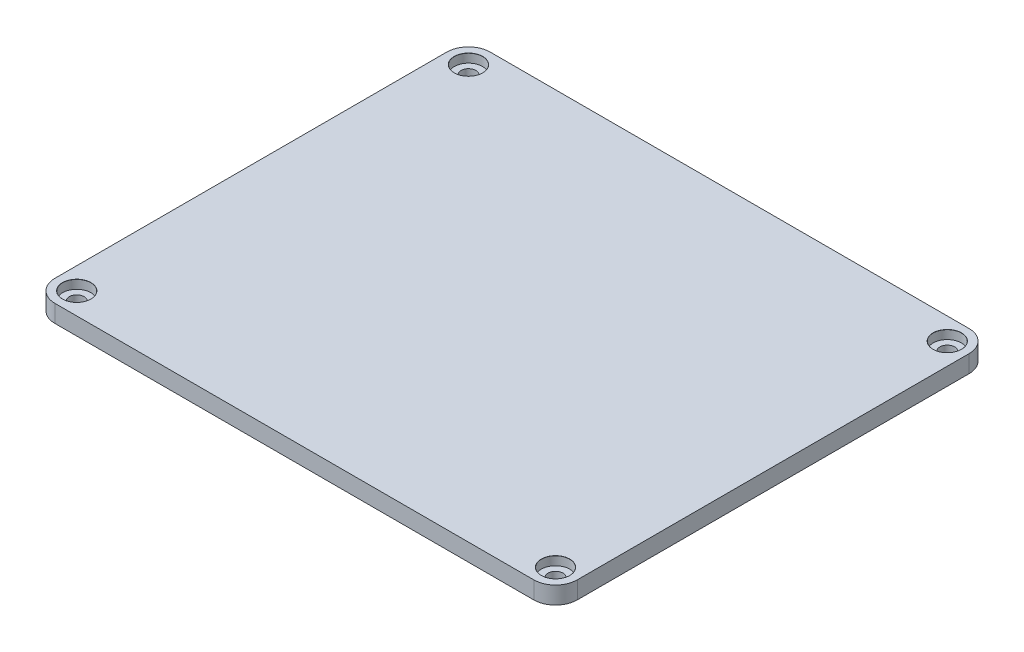
ISO-10303-21;
HEADER;
FILE_DESCRIPTION(('STEP AP214'),'2;1');
FILE_NAME('part.step','',(''),(''),'','','');
FILE_SCHEMA(('AUTOMOTIVE_DESIGN { 1 0 10303 214 1 1 1 1 }'));
ENDSEC;
DATA;
#1=APPLICATION_CONTEXT('core data for automotive mechanical design processes');
#2=APPLICATION_PROTOCOL_DEFINITION('international standard','automotive_design',2000,#1);
#3=PRODUCT_CONTEXT('',#1,'mechanical');
#4=PRODUCT('Part','Part','',(#3));
#5=PRODUCT_RELATED_PRODUCT_CATEGORY('part','',(#4));
#6=PRODUCT_DEFINITION_FORMATION('','',#4);
#7=PRODUCT_DEFINITION_CONTEXT('part definition',#1,'design');
#8=PRODUCT_DEFINITION('design','',#6,#7);
#9=PRODUCT_DEFINITION_SHAPE('','',#8);
#10=(LENGTH_UNIT() NAMED_UNIT(*) SI_UNIT(.MILLI.,.METRE.));
#11=(NAMED_UNIT(*) PLANE_ANGLE_UNIT() SI_UNIT($,.RADIAN.));
#12=(NAMED_UNIT(*) SI_UNIT($,.STERADIAN.) SOLID_ANGLE_UNIT());
#13=UNCERTAINTY_MEASURE_WITH_UNIT(LENGTH_MEASURE(1.E-05),#10,'distance_accuracy_value','');
#14=(GEOMETRIC_REPRESENTATION_CONTEXT(3) GLOBAL_UNCERTAINTY_ASSIGNED_CONTEXT((#13)) GLOBAL_UNIT_ASSIGNED_CONTEXT((#10,
#11,#12)) REPRESENTATION_CONTEXT('',''));
#15=CARTESIAN_POINT('',(0.,0.,0.));
#16=DIRECTION('',(0.,0.,1.));
#17=DIRECTION('',(1.,0.,0.));
#18=AXIS2_PLACEMENT_3D('',#15,#16,#17);
#19=CARTESIAN_POINT('',(60.,4.,50.));
#20=DIRECTION('',(-1.,0.,0.));
#21=DIRECTION('',(0.,0.,1.));
#22=AXIS2_PLACEMENT_3D('',#19,#20,#21);
#23=PLANE('',#22);
#24=DIRECTION('',(0.,0.,-1.));
#25=VECTOR('',#24,1.);
#26=CARTESIAN_POINT('',(60.,4.,50.));
#27=LINE('',#26,#25);
#28=CARTESIAN_POINT('',(60.,4.,45.));
#29=VERTEX_POINT('',#28);
#30=CARTESIAN_POINT('',(60.,4.,-45.));
#31=VERTEX_POINT('',#30);
#32=EDGE_CURVE('E141',#29,#31,#27,.T.);
#33=ORIENTED_EDGE('',*,*,#32,.F.);
#34=DIRECTION('',(0.,-1.,0.));
#35=VECTOR('',#34,1.);
#36=CARTESIAN_POINT('',(60.,4.,45.));
#37=LINE('',#36,#35);
#38=CARTESIAN_POINT('',(60.,0.,45.));
#39=VERTEX_POINT('',#38);
#40=EDGE_CURVE('E180',#29,#39,#37,.T.);
#41=ORIENTED_EDGE('',*,*,#40,.T.);
#42=DIRECTION('',(0.,0.,-1.));
#43=VECTOR('',#42,1.);
#44=CARTESIAN_POINT('',(60.,0.,50.));
#45=LINE('',#44,#43);
#46=CARTESIAN_POINT('',(60.,0.,-45.));
#47=VERTEX_POINT('',#46);
#48=EDGE_CURVE('E195',#39,#47,#45,.T.);
#49=ORIENTED_EDGE('',*,*,#48,.T.);
#50=DIRECTION('',(0.,-1.,0.));
#51=VECTOR('',#50,1.);
#52=CARTESIAN_POINT('',(60.,4.,-45.));
#53=LINE('',#52,#51);
#54=EDGE_CURVE('E177',#47,#31,#53,.F.);
#55=ORIENTED_EDGE('',*,*,#54,.T.);
#56=EDGE_LOOP('',(#33,#41,#49,#55));
#57=FACE_BOUND('',#56,.T.);
#58=ADVANCED_FACE('F45',(#57),#23,.F.);
#59=CARTESIAN_POINT('',(-60.,4.,-50.));
#60=DIRECTION('',(0.,0.,1.));
#61=DIRECTION('',(1.,0.,0.));
#62=AXIS2_PLACEMENT_3D('',#59,#60,#61);
#63=PLANE('',#62);
#64=DIRECTION('',(-1.,0.,0.));
#65=VECTOR('',#64,1.);
#66=CARTESIAN_POINT('',(-60.,4.,-50.));
#67=LINE('',#66,#65);
#68=CARTESIAN_POINT('',(55.,4.,-50.));
#69=VERTEX_POINT('',#68);
#70=CARTESIAN_POINT('',(-55.,4.,-50.));
#71=VERTEX_POINT('',#70);
#72=EDGE_CURVE('E146',#69,#71,#67,.T.);
#73=ORIENTED_EDGE('',*,*,#72,.F.);
#74=DIRECTION('',(0.,-1.,0.));
#75=VECTOR('',#74,1.);
#76=CARTESIAN_POINT('',(55.,4.,-50.));
#77=LINE('',#76,#75);
#78=CARTESIAN_POINT('',(55.,0.,-50.));
#79=VERTEX_POINT('',#78);
#80=EDGE_CURVE('E11',#69,#79,#77,.T.);
#81=ORIENTED_EDGE('',*,*,#80,.T.);
#82=DIRECTION('',(-1.,0.,0.));
#83=VECTOR('',#82,1.);
#84=CARTESIAN_POINT('',(-60.,0.,-50.));
#85=LINE('',#84,#83);
#86=CARTESIAN_POINT('',(-55.,0.,-50.));
#87=VERTEX_POINT('',#86);
#88=EDGE_CURVE('E148',#79,#87,#85,.T.);
#89=ORIENTED_EDGE('',*,*,#88,.T.);
#90=DIRECTION('',(0.,-1.,0.));
#91=VECTOR('',#90,1.);
#92=CARTESIAN_POINT('',(-55.,4.,-50.));
#93=LINE('',#92,#91);
#94=EDGE_CURVE('E54',#87,#71,#93,.F.);
#95=ORIENTED_EDGE('',*,*,#94,.T.);
#96=EDGE_LOOP('',(#73,#81,#89,#95));
#97=FACE_BOUND('',#96,.T.);
#98=ADVANCED_FACE('F201',(#97),#63,.F.);
#99=CARTESIAN_POINT('',(-60.,4.,50.));
#100=DIRECTION('',(1.,0.,0.));
#101=DIRECTION('',(0.,0.,-1.));
#102=AXIS2_PLACEMENT_3D('',#99,#100,#101);
#103=PLANE('',#102);
#104=DIRECTION('',(0.,0.,1.));
#105=VECTOR('',#104,1.);
#106=CARTESIAN_POINT('',(-60.,0.,50.));
#107=LINE('',#106,#105);
#108=CARTESIAN_POINT('',(-60.,0.,-45.));
#109=VERTEX_POINT('',#108);
#110=CARTESIAN_POINT('',(-60.,0.,45.));
#111=VERTEX_POINT('',#110);
#112=EDGE_CURVE('E142',#109,#111,#107,.T.);
#113=ORIENTED_EDGE('',*,*,#112,.T.);
#114=DIRECTION('',(0.,-1.,0.));
#115=VECTOR('',#114,1.);
#116=CARTESIAN_POINT('',(-60.,4.,45.));
#117=LINE('',#116,#115);
#118=CARTESIAN_POINT('',(-60.,4.,45.));
#119=VERTEX_POINT('',#118);
#120=EDGE_CURVE('E117',#111,#119,#117,.F.);
#121=ORIENTED_EDGE('',*,*,#120,.T.);
#122=DIRECTION('',(0.,0.,1.));
#123=VECTOR('',#122,1.);
#124=CARTESIAN_POINT('',(-60.,4.,50.));
#125=LINE('',#124,#123);
#126=CARTESIAN_POINT('',(-60.,4.,-45.));
#127=VERTEX_POINT('',#126);
#128=EDGE_CURVE('E186',#127,#119,#125,.T.);
#129=ORIENTED_EDGE('',*,*,#128,.F.);
#130=DIRECTION('',(0.,-1.,0.));
#131=VECTOR('',#130,1.);
#132=CARTESIAN_POINT('',(-60.,4.,-45.));
#133=LINE('',#132,#131);
#134=EDGE_CURVE('E123',#127,#109,#133,.T.);
#135=ORIENTED_EDGE('',*,*,#134,.T.);
#136=EDGE_LOOP('',(#113,#121,#129,#135));
#137=FACE_BOUND('',#136,.T.);
#138=ADVANCED_FACE('F208',(#137),#103,.F.);
#139=CARTESIAN_POINT('',(-60.,4.,50.));
#140=DIRECTION('',(0.,0.,-1.));
#141=DIRECTION('',(-1.,0.,0.));
#142=AXIS2_PLACEMENT_3D('',#139,#140,#141);
#143=PLANE('',#142);
#144=DIRECTION('',(1.,0.,0.));
#145=VECTOR('',#144,1.);
#146=CARTESIAN_POINT('',(-60.,4.,50.));
#147=LINE('',#146,#145);
#148=CARTESIAN_POINT('',(-55.,4.,50.));
#149=VERTEX_POINT('',#148);
#150=CARTESIAN_POINT('',(55.,4.,50.));
#151=VERTEX_POINT('',#150);
#152=EDGE_CURVE('E133',#149,#151,#147,.T.);
#153=ORIENTED_EDGE('',*,*,#152,.F.);
#154=DIRECTION('',(0.,-1.,0.));
#155=VECTOR('',#154,1.);
#156=CARTESIAN_POINT('',(-55.,4.,50.));
#157=LINE('',#156,#155);
#158=CARTESIAN_POINT('',(-55.,0.,50.));
#159=VERTEX_POINT('',#158);
#160=EDGE_CURVE('E116',#149,#159,#157,.T.);
#161=ORIENTED_EDGE('',*,*,#160,.T.);
#162=DIRECTION('',(1.,0.,0.));
#163=VECTOR('',#162,1.);
#164=CARTESIAN_POINT('',(-60.,0.,50.));
#165=LINE('',#164,#163);
#166=CARTESIAN_POINT('',(55.,0.,50.));
#167=VERTEX_POINT('',#166);
#168=EDGE_CURVE('E130',#159,#167,#165,.T.);
#169=ORIENTED_EDGE('',*,*,#168,.T.);
#170=DIRECTION('',(0.,-1.,0.));
#171=VECTOR('',#170,1.);
#172=CARTESIAN_POINT('',(55.,4.,50.));
#173=LINE('',#172,#171);
#174=EDGE_CURVE('E136',#167,#151,#173,.F.);
#175=ORIENTED_EDGE('',*,*,#174,.T.);
#176=EDGE_LOOP('',(#153,#161,#169,#175));
#177=FACE_BOUND('',#176,.T.);
#178=ADVANCED_FACE('F129',(#177),#143,.F.);
#179=CARTESIAN_POINT('',(0.,4.,0.));
#180=DIRECTION('',(0.,-1.,0.));
#181=DIRECTION('',(0.,0.,-1.));
#182=AXIS2_PLACEMENT_3D('',#179,#180,#181);
#183=PLANE('',#182);
#184=CARTESIAN_POINT('',(-55.,4.,45.));
#185=DIRECTION('',(0.,1.,0.));
#186=DIRECTION('',(0.,0.,1.));
#187=AXIS2_PLACEMENT_3D('',#184,#185,#186);
#188=CIRCLE('',#187,3.275);
#189=CARTESIAN_POINT('',(-55.,4.,48.275));
#190=VERTEX_POINT('',#189);
#191=EDGE_CURVE('E461',#190,#190,#188,.T.);
#192=ORIENTED_EDGE('',*,*,#191,.F.);
#193=EDGE_LOOP('',(#192));
#194=FACE_BOUND('',#193,.T.);
#195=CARTESIAN_POINT('',(55.,4.,-45.));
#196=DIRECTION('',(0.,1.,0.));
#197=DIRECTION('',(0.,0.,1.));
#198=AXIS2_PLACEMENT_3D('',#195,#196,#197);
#199=CIRCLE('',#198,3.275);
#200=CARTESIAN_POINT('',(55.,4.,-41.725));
#201=VERTEX_POINT('',#200);
#202=EDGE_CURVE('E465',#201,#201,#199,.T.);
#203=ORIENTED_EDGE('',*,*,#202,.F.);
#204=EDGE_LOOP('',(#203));
#205=FACE_BOUND('',#204,.T.);
#206=CARTESIAN_POINT('',(-55.,4.,-45.));
#207=DIRECTION('',(0.,1.,0.));
#208=DIRECTION('',(0.,0.,1.));
#209=AXIS2_PLACEMENT_3D('',#206,#207,#208);
#210=CIRCLE('',#209,3.275);
#211=CARTESIAN_POINT('',(-55.,4.,-41.725));
#212=VERTEX_POINT('',#211);
#213=EDGE_CURVE('E469',#212,#212,#210,.T.);
#214=ORIENTED_EDGE('',*,*,#213,.F.);
#215=EDGE_LOOP('',(#214));
#216=FACE_BOUND('',#215,.T.);
#217=CARTESIAN_POINT('',(55.,4.,45.));
#218=DIRECTION('',(0.,1.,0.));
#219=DIRECTION('',(0.,0.,1.));
#220=AXIS2_PLACEMENT_3D('',#217,#218,#219);
#221=CIRCLE('',#220,3.275);
#222=CARTESIAN_POINT('',(55.,4.,48.275));
#223=VERTEX_POINT('',#222);
#224=EDGE_CURVE('E472',#223,#223,#221,.T.);
#225=ORIENTED_EDGE('',*,*,#224,.F.);
#226=EDGE_LOOP('',(#225));
#227=FACE_BOUND('',#226,.T.);
#228=ORIENTED_EDGE('',*,*,#128,.T.);
#229=CARTESIAN_POINT('',(-55.,4.,45.));
#230=DIRECTION('',(0.,-1.,0.));
#231=DIRECTION('',(0.,0.,-1.));
#232=AXIS2_PLACEMENT_3D('',#229,#230,#231);
#233=CIRCLE('',#232,5.);
#234=EDGE_CURVE('E174',#119,#149,#233,.F.);
#235=ORIENTED_EDGE('',*,*,#234,.T.);
#236=ORIENTED_EDGE('',*,*,#152,.T.);
#237=CARTESIAN_POINT('',(55.,4.,45.));
#238=DIRECTION('',(0.,-1.,0.));
#239=DIRECTION('',(0.,0.,-1.));
#240=AXIS2_PLACEMENT_3D('',#237,#238,#239);
#241=CIRCLE('',#240,5.);
#242=EDGE_CURVE('E171',#151,#29,#241,.F.);
#243=ORIENTED_EDGE('',*,*,#242,.T.);
#244=ORIENTED_EDGE('',*,*,#32,.T.);
#245=CARTESIAN_POINT('',(55.,4.,-45.));
#246=DIRECTION('',(0.,-1.,0.));
#247=DIRECTION('',(0.,0.,-1.));
#248=AXIS2_PLACEMENT_3D('',#245,#246,#247);
#249=CIRCLE('',#248,5.);
#250=EDGE_CURVE('E67',#31,#69,#249,.F.);
#251=ORIENTED_EDGE('',*,*,#250,.T.);
#252=ORIENTED_EDGE('',*,*,#72,.T.);
#253=CARTESIAN_POINT('',(-55.,4.,-45.));
#254=DIRECTION('',(0.,-1.,0.));
#255=DIRECTION('',(0.,0.,-1.));
#256=AXIS2_PLACEMENT_3D('',#253,#254,#255);
#257=CIRCLE('',#256,5.);
#258=EDGE_CURVE('E166',#71,#127,#257,.F.);
#259=ORIENTED_EDGE('',*,*,#258,.T.);
#260=EDGE_LOOP('',(#228,#235,#236,#243,#244,#251,#252,#259));
#261=FACE_BOUND('',#260,.T.);
#262=ADVANCED_FACE('F206',(#194,#205,#216,#227,#261),#183,.F.);
#263=CARTESIAN_POINT('',(0.,0.,0.));
#264=DIRECTION('',(0.,-1.,0.));
#265=DIRECTION('',(0.,0.,-1.));
#266=AXIS2_PLACEMENT_3D('',#263,#264,#265);
#267=PLANE('',#266);
#268=CARTESIAN_POINT('',(-55.,0.,45.));
#269=DIRECTION('',(0.,1.,0.));
#270=DIRECTION('',(0.,0.,1.));
#271=AXIS2_PLACEMENT_3D('',#268,#269,#270);
#272=CIRCLE('',#271,1.7);
#273=CARTESIAN_POINT('',(-55.,0.,46.7));
#274=VERTEX_POINT('',#273);
#275=EDGE_CURVE('E535',#274,#274,#272,.T.);
#276=ORIENTED_EDGE('',*,*,#275,.T.);
#277=EDGE_LOOP('',(#276));
#278=FACE_BOUND('',#277,.T.);
#279=CARTESIAN_POINT('',(55.,0.,-45.));
#280=DIRECTION('',(0.,1.,0.));
#281=DIRECTION('',(0.,0.,1.));
#282=AXIS2_PLACEMENT_3D('',#279,#280,#281);
#283=CIRCLE('',#282,1.7);
#284=CARTESIAN_POINT('',(55.,0.,-43.3));
#285=VERTEX_POINT('',#284);
#286=EDGE_CURVE('E517',#285,#285,#283,.T.);
#287=ORIENTED_EDGE('',*,*,#286,.T.);
#288=EDGE_LOOP('',(#287));
#289=FACE_BOUND('',#288,.T.);
#290=CARTESIAN_POINT('',(-55.,0.,-45.));
#291=DIRECTION('',(0.,1.,0.));
#292=DIRECTION('',(0.,0.,1.));
#293=AXIS2_PLACEMENT_3D('',#290,#291,#292);
#294=CIRCLE('',#293,1.7);
#295=CARTESIAN_POINT('',(-55.,0.,-43.3));
#296=VERTEX_POINT('',#295);
#297=EDGE_CURVE('E476',#296,#296,#294,.T.);
#298=ORIENTED_EDGE('',*,*,#297,.T.);
#299=EDGE_LOOP('',(#298));
#300=FACE_BOUND('',#299,.T.);
#301=CARTESIAN_POINT('',(55.,0.,45.));
#302=DIRECTION('',(0.,1.,0.));
#303=DIRECTION('',(0.,0.,1.));
#304=AXIS2_PLACEMENT_3D('',#301,#302,#303);
#305=CIRCLE('',#304,1.7);
#306=CARTESIAN_POINT('',(55.,0.,46.7));
#307=VERTEX_POINT('',#306);
#308=EDGE_CURVE('E198',#307,#307,#305,.T.);
#309=ORIENTED_EDGE('',*,*,#308,.T.);
#310=EDGE_LOOP('',(#309));
#311=FACE_BOUND('',#310,.T.);
#312=ORIENTED_EDGE('',*,*,#168,.F.);
#313=CARTESIAN_POINT('',(-55.,0.,45.));
#314=DIRECTION('',(0.,-1.,0.));
#315=DIRECTION('',(0.,0.,-1.));
#316=AXIS2_PLACEMENT_3D('',#313,#314,#315);
#317=CIRCLE('',#316,5.);
#318=EDGE_CURVE('E112',#159,#111,#317,.T.);
#319=ORIENTED_EDGE('',*,*,#318,.T.);
#320=ORIENTED_EDGE('',*,*,#112,.F.);
#321=CARTESIAN_POINT('',(-55.,0.,-45.));
#322=DIRECTION('',(0.,-1.,0.));
#323=DIRECTION('',(0.,0.,-1.));
#324=AXIS2_PLACEMENT_3D('',#321,#322,#323);
#325=CIRCLE('',#324,5.);
#326=EDGE_CURVE('E135',#109,#87,#325,.T.);
#327=ORIENTED_EDGE('',*,*,#326,.T.);
#328=ORIENTED_EDGE('',*,*,#88,.F.);
#329=CARTESIAN_POINT('',(55.,0.,-45.));
#330=DIRECTION('',(0.,-1.,0.));
#331=DIRECTION('',(0.,0.,-1.));
#332=AXIS2_PLACEMENT_3D('',#329,#330,#331);
#333=CIRCLE('',#332,5.);
#334=EDGE_CURVE('E156',#79,#47,#333,.T.);
#335=ORIENTED_EDGE('',*,*,#334,.T.);
#336=ORIENTED_EDGE('',*,*,#48,.F.);
#337=CARTESIAN_POINT('',(55.,0.,45.));
#338=DIRECTION('',(0.,-1.,0.));
#339=DIRECTION('',(0.,0.,-1.));
#340=AXIS2_PLACEMENT_3D('',#337,#338,#339);
#341=CIRCLE('',#340,5.);
#342=EDGE_CURVE('E124',#39,#167,#341,.T.);
#343=ORIENTED_EDGE('',*,*,#342,.T.);
#344=EDGE_LOOP('',(#312,#319,#320,#327,#328,#335,#336,#343));
#345=FACE_BOUND('',#344,.T.);
#346=ADVANCED_FACE('F138',(#278,#289,#300,#311,#345),#267,.T.);
#347=CARTESIAN_POINT('',(55.,4.,45.));
#348=DIRECTION('',(0.,1.,0.));
#349=DIRECTION('',(0.,0.,1.));
#350=AXIS2_PLACEMENT_3D('',#347,#348,#349);
#351=CYLINDRICAL_SURFACE('',#350,1.7);
#352=ORIENTED_EDGE('',*,*,#308,.F.);
#353=EDGE_LOOP('',(#352));
#354=FACE_BOUND('',#353,.T.);
#355=CARTESIAN_POINT('',(55.,2.,45.));
#356=DIRECTION('',(0.,1.,0.));
#357=DIRECTION('',(0.,0.,1.));
#358=AXIS2_PLACEMENT_3D('',#355,#356,#357);
#359=CIRCLE('',#358,1.7);
#360=CARTESIAN_POINT('',(55.,2.,46.7));
#361=VERTEX_POINT('',#360);
#362=EDGE_CURVE('E491',#361,#361,#359,.T.);
#363=ORIENTED_EDGE('',*,*,#362,.T.);
#364=EDGE_LOOP('',(#363));
#365=FACE_BOUND('',#364,.T.);
#366=ADVANCED_FACE('F408',(#354,#365),#351,.F.);
#367=CARTESIAN_POINT('',(58.25,2.,45.));
#368=DIRECTION('',(0.,-1.,0.));
#369=DIRECTION('',(0.,0.,-1.));
#370=AXIS2_PLACEMENT_3D('',#367,#368,#369);
#371=PLANE('',#370);
#372=ORIENTED_EDGE('',*,*,#362,.F.);
#373=EDGE_LOOP('',(#372));
#374=FACE_BOUND('',#373,.T.);
#375=CARTESIAN_POINT('',(55.,2.,45.));
#376=DIRECTION('',(0.,1.,0.));
#377=DIRECTION('',(0.,0.,1.));
#378=AXIS2_PLACEMENT_3D('',#375,#376,#377);
#379=CIRCLE('',#378,3.25);
#380=CARTESIAN_POINT('',(55.,2.,48.25));
#381=VERTEX_POINT('',#380);
#382=EDGE_CURVE('E481',#381,#381,#379,.T.);
#383=ORIENTED_EDGE('',*,*,#382,.T.);
#384=EDGE_LOOP('',(#383));
#385=FACE_BOUND('',#384,.T.);
#386=ADVANCED_FACE('F398',(#374,#385),#371,.F.);
#387=CARTESIAN_POINT('',(55.,4.,45.));
#388=DIRECTION('',(0.,1.,0.));
#389=DIRECTION('',(0.,0.,1.));
#390=AXIS2_PLACEMENT_3D('',#387,#388,#389);
#391=CYLINDRICAL_SURFACE('',#390,3.25);
#392=ORIENTED_EDGE('',*,*,#382,.F.);
#393=EDGE_LOOP('',(#392));
#394=FACE_BOUND('',#393,.T.);
#395=CARTESIAN_POINT('',(55.,3.975,45.));
#396=DIRECTION('',(0.,1.,0.));
#397=DIRECTION('',(0.,0.,1.));
#398=AXIS2_PLACEMENT_3D('',#395,#396,#397);
#399=CIRCLE('',#398,3.25);
#400=CARTESIAN_POINT('',(55.,3.975,48.25));
#401=VERTEX_POINT('',#400);
#402=EDGE_CURVE('E475',#401,#401,#399,.T.);
#403=ORIENTED_EDGE('',*,*,#402,.T.);
#404=EDGE_LOOP('',(#403));
#405=FACE_BOUND('',#404,.T.);
#406=ADVANCED_FACE('F388',(#394,#405),#391,.F.);
#407=CARTESIAN_POINT('',(55.,4.,45.));
#408=DIRECTION('',(0.,1.,0.));
#409=DIRECTION('',(0.,0.,1.));
#410=AXIS2_PLACEMENT_3D('',#407,#408,#409);
#411=CONICAL_SURFACE('',#410,3.275,0.785398163397518);
#412=ORIENTED_EDGE('',*,*,#402,.F.);
#413=EDGE_LOOP('',(#412));
#414=FACE_BOUND('',#413,.T.);
#415=ORIENTED_EDGE('',*,*,#224,.T.);
#416=EDGE_LOOP('',(#415));
#417=FACE_BOUND('',#416,.T.);
#418=ADVANCED_FACE('F378',(#414,#417),#411,.F.);
#419=CARTESIAN_POINT('',(-55.,4.,-45.));
#420=DIRECTION('',(0.,1.,0.));
#421=DIRECTION('',(0.,0.,1.));
#422=AXIS2_PLACEMENT_3D('',#419,#420,#421);
#423=CYLINDRICAL_SURFACE('',#422,1.7);
#424=ORIENTED_EDGE('',*,*,#297,.F.);
#425=EDGE_LOOP('',(#424));
#426=FACE_BOUND('',#425,.T.);
#427=CARTESIAN_POINT('',(-55.,2.,-45.));
#428=DIRECTION('',(0.,1.,0.));
#429=DIRECTION('',(0.,0.,1.));
#430=AXIS2_PLACEMENT_3D('',#427,#428,#429);
#431=CIRCLE('',#430,1.7);
#432=CARTESIAN_POINT('',(-55.,2.,-43.3));
#433=VERTEX_POINT('',#432);
#434=EDGE_CURVE('E484',#433,#433,#431,.T.);
#435=ORIENTED_EDGE('',*,*,#434,.T.);
#436=EDGE_LOOP('',(#435));
#437=FACE_BOUND('',#436,.T.);
#438=ADVANCED_FACE('F368',(#426,#437),#423,.F.);
#439=CARTESIAN_POINT('',(-51.75,2.,-45.));
#440=DIRECTION('',(0.,-1.,0.));
#441=DIRECTION('',(0.,0.,-1.));
#442=AXIS2_PLACEMENT_3D('',#439,#440,#441);
#443=PLANE('',#442);
#444=ORIENTED_EDGE('',*,*,#434,.F.);
#445=EDGE_LOOP('',(#444));
#446=FACE_BOUND('',#445,.T.);
#447=CARTESIAN_POINT('',(-55.,2.,-45.));
#448=DIRECTION('',(0.,1.,0.));
#449=DIRECTION('',(0.,0.,1.));
#450=AXIS2_PLACEMENT_3D('',#447,#448,#449);
#451=CIRCLE('',#450,3.25);
#452=CARTESIAN_POINT('',(-55.,2.,-41.75));
#453=VERTEX_POINT('',#452);
#454=EDGE_CURVE('E507',#453,#453,#451,.T.);
#455=ORIENTED_EDGE('',*,*,#454,.T.);
#456=EDGE_LOOP('',(#455));
#457=FACE_BOUND('',#456,.T.);
#458=ADVANCED_FACE('F358',(#446,#457),#443,.F.);
#459=CARTESIAN_POINT('',(-55.,4.,-45.));
#460=DIRECTION('',(0.,1.,0.));
#461=DIRECTION('',(0.,0.,1.));
#462=AXIS2_PLACEMENT_3D('',#459,#460,#461);
#463=CYLINDRICAL_SURFACE('',#462,3.25);
#464=ORIENTED_EDGE('',*,*,#454,.F.);
#465=EDGE_LOOP('',(#464));
#466=FACE_BOUND('',#465,.T.);
#467=CARTESIAN_POINT('',(-55.,3.975,-45.));
#468=DIRECTION('',(0.,1.,0.));
#469=DIRECTION('',(0.,0.,1.));
#470=AXIS2_PLACEMENT_3D('',#467,#468,#469);
#471=CIRCLE('',#470,3.25);
#472=CARTESIAN_POINT('',(-55.,3.975,-41.75));
#473=VERTEX_POINT('',#472);
#474=EDGE_CURVE('E511',#473,#473,#471,.T.);
#475=ORIENTED_EDGE('',*,*,#474,.T.);
#476=EDGE_LOOP('',(#475));
#477=FACE_BOUND('',#476,.T.);
#478=ADVANCED_FACE('F348',(#466,#477),#463,.F.);
#479=CARTESIAN_POINT('',(-55.,4.,-45.));
#480=DIRECTION('',(0.,1.,0.));
#481=DIRECTION('',(0.,0.,1.));
#482=AXIS2_PLACEMENT_3D('',#479,#480,#481);
#483=CONICAL_SURFACE('',#482,3.275,0.785398163397518);
#484=ORIENTED_EDGE('',*,*,#474,.F.);
#485=EDGE_LOOP('',(#484));
#486=FACE_BOUND('',#485,.T.);
#487=ORIENTED_EDGE('',*,*,#213,.T.);
#488=EDGE_LOOP('',(#487));
#489=FACE_BOUND('',#488,.T.);
#490=ADVANCED_FACE('F338',(#486,#489),#483,.F.);
#491=CARTESIAN_POINT('',(55.,4.,-45.));
#492=DIRECTION('',(0.,1.,0.));
#493=DIRECTION('',(0.,0.,1.));
#494=AXIS2_PLACEMENT_3D('',#491,#492,#493);
#495=CYLINDRICAL_SURFACE('',#494,1.7);
#496=ORIENTED_EDGE('',*,*,#286,.F.);
#497=EDGE_LOOP('',(#496));
#498=FACE_BOUND('',#497,.T.);
#499=CARTESIAN_POINT('',(55.,2.,-45.));
#500=DIRECTION('',(0.,1.,0.));
#501=DIRECTION('',(0.,0.,1.));
#502=AXIS2_PLACEMENT_3D('',#499,#500,#501);
#503=CIRCLE('',#502,1.7);
#504=CARTESIAN_POINT('',(55.,2.,-43.3));
#505=VERTEX_POINT('',#504);
#506=EDGE_CURVE('E521',#505,#505,#503,.T.);
#507=ORIENTED_EDGE('',*,*,#506,.T.);
#508=EDGE_LOOP('',(#507));
#509=FACE_BOUND('',#508,.T.);
#510=ADVANCED_FACE('F328',(#498,#509),#495,.F.);
#511=CARTESIAN_POINT('',(58.25,2.,-45.));
#512=DIRECTION('',(0.,-1.,0.));
#513=DIRECTION('',(0.,0.,-1.));
#514=AXIS2_PLACEMENT_3D('',#511,#512,#513);
#515=PLANE('',#514);
#516=ORIENTED_EDGE('',*,*,#506,.F.);
#517=EDGE_LOOP('',(#516));
#518=FACE_BOUND('',#517,.T.);
#519=CARTESIAN_POINT('',(55.,2.,-45.));
#520=DIRECTION('',(0.,1.,0.));
#521=DIRECTION('',(0.,0.,1.));
#522=AXIS2_PLACEMENT_3D('',#519,#520,#521);
#523=CIRCLE('',#522,3.25);
#524=CARTESIAN_POINT('',(55.,2.,-41.75));
#525=VERTEX_POINT('',#524);
#526=EDGE_CURVE('E525',#525,#525,#523,.T.);
#527=ORIENTED_EDGE('',*,*,#526,.T.);
#528=EDGE_LOOP('',(#527));
#529=FACE_BOUND('',#528,.T.);
#530=ADVANCED_FACE('F318',(#518,#529),#515,.F.);
#531=CARTESIAN_POINT('',(55.,4.,-45.));
#532=DIRECTION('',(0.,1.,0.));
#533=DIRECTION('',(0.,0.,1.));
#534=AXIS2_PLACEMENT_3D('',#531,#532,#533);
#535=CYLINDRICAL_SURFACE('',#534,3.25);
#536=ORIENTED_EDGE('',*,*,#526,.F.);
#537=EDGE_LOOP('',(#536));
#538=FACE_BOUND('',#537,.T.);
#539=CARTESIAN_POINT('',(55.,3.975,-45.));
#540=DIRECTION('',(0.,1.,0.));
#541=DIRECTION('',(0.,0.,1.));
#542=AXIS2_PLACEMENT_3D('',#539,#540,#541);
#543=CIRCLE('',#542,3.25);
#544=CARTESIAN_POINT('',(55.,3.975,-41.75));
#545=VERTEX_POINT('',#544);
#546=EDGE_CURVE('E529',#545,#545,#543,.T.);
#547=ORIENTED_EDGE('',*,*,#546,.T.);
#548=EDGE_LOOP('',(#547));
#549=FACE_BOUND('',#548,.T.);
#550=ADVANCED_FACE('F308',(#538,#549),#535,.F.);
#551=CARTESIAN_POINT('',(55.,4.,-45.));
#552=DIRECTION('',(0.,1.,0.));
#553=DIRECTION('',(0.,0.,1.));
#554=AXIS2_PLACEMENT_3D('',#551,#552,#553);
#555=CONICAL_SURFACE('',#554,3.275,0.785398163397518);
#556=ORIENTED_EDGE('',*,*,#546,.F.);
#557=EDGE_LOOP('',(#556));
#558=FACE_BOUND('',#557,.T.);
#559=ORIENTED_EDGE('',*,*,#202,.T.);
#560=EDGE_LOOP('',(#559));
#561=FACE_BOUND('',#560,.T.);
#562=ADVANCED_FACE('F298',(#558,#561),#555,.F.);
#563=CARTESIAN_POINT('',(-55.,4.,45.));
#564=DIRECTION('',(0.,1.,0.));
#565=DIRECTION('',(0.,0.,1.));
#566=AXIS2_PLACEMENT_3D('',#563,#564,#565);
#567=CYLINDRICAL_SURFACE('',#566,1.7);
#568=ORIENTED_EDGE('',*,*,#275,.F.);
#569=EDGE_LOOP('',(#568));
#570=FACE_BOUND('',#569,.T.);
#571=CARTESIAN_POINT('',(-55.,2.,45.));
#572=DIRECTION('',(0.,1.,0.));
#573=DIRECTION('',(0.,0.,1.));
#574=AXIS2_PLACEMENT_3D('',#571,#572,#573);
#575=CIRCLE('',#574,1.7);
#576=CARTESIAN_POINT('',(-55.,2.,46.7));
#577=VERTEX_POINT('',#576);
#578=EDGE_CURVE('E539',#577,#577,#575,.T.);
#579=ORIENTED_EDGE('',*,*,#578,.T.);
#580=EDGE_LOOP('',(#579));
#581=FACE_BOUND('',#580,.T.);
#582=ADVANCED_FACE('F288',(#570,#581),#567,.F.);
#583=CARTESIAN_POINT('',(-51.75,2.,45.));
#584=DIRECTION('',(0.,-1.,0.));
#585=DIRECTION('',(0.,0.,-1.));
#586=AXIS2_PLACEMENT_3D('',#583,#584,#585);
#587=PLANE('',#586);
#588=ORIENTED_EDGE('',*,*,#578,.F.);
#589=EDGE_LOOP('',(#588));
#590=FACE_BOUND('',#589,.T.);
#591=CARTESIAN_POINT('',(-55.,2.,45.));
#592=DIRECTION('',(0.,1.,0.));
#593=DIRECTION('',(0.,0.,1.));
#594=AXIS2_PLACEMENT_3D('',#591,#592,#593);
#595=CIRCLE('',#594,3.25);
#596=CARTESIAN_POINT('',(-55.,2.,48.25));
#597=VERTEX_POINT('',#596);
#598=EDGE_CURVE('E543',#597,#597,#595,.T.);
#599=ORIENTED_EDGE('',*,*,#598,.T.);
#600=EDGE_LOOP('',(#599));
#601=FACE_BOUND('',#600,.T.);
#602=ADVANCED_FACE('F278',(#590,#601),#587,.F.);
#603=CARTESIAN_POINT('',(-55.,4.,45.));
#604=DIRECTION('',(0.,1.,0.));
#605=DIRECTION('',(0.,0.,1.));
#606=AXIS2_PLACEMENT_3D('',#603,#604,#605);
#607=CYLINDRICAL_SURFACE('',#606,3.25);
#608=ORIENTED_EDGE('',*,*,#598,.F.);
#609=EDGE_LOOP('',(#608));
#610=FACE_BOUND('',#609,.T.);
#611=CARTESIAN_POINT('',(-55.,3.975,45.));
#612=DIRECTION('',(0.,1.,0.));
#613=DIRECTION('',(0.,0.,1.));
#614=AXIS2_PLACEMENT_3D('',#611,#612,#613);
#615=CIRCLE('',#614,3.25);
#616=CARTESIAN_POINT('',(-55.,3.975,48.25));
#617=VERTEX_POINT('',#616);
#618=EDGE_CURVE('E547',#617,#617,#615,.T.);
#619=ORIENTED_EDGE('',*,*,#618,.T.);
#620=EDGE_LOOP('',(#619));
#621=FACE_BOUND('',#620,.T.);
#622=ADVANCED_FACE('F268',(#610,#621),#607,.F.);
#623=CARTESIAN_POINT('',(-55.,4.,45.));
#624=DIRECTION('',(0.,1.,0.));
#625=DIRECTION('',(0.,0.,1.));
#626=AXIS2_PLACEMENT_3D('',#623,#624,#625);
#627=CONICAL_SURFACE('',#626,3.275,0.785398163397518);
#628=ORIENTED_EDGE('',*,*,#618,.F.);
#629=EDGE_LOOP('',(#628));
#630=FACE_BOUND('',#629,.T.);
#631=ORIENTED_EDGE('',*,*,#191,.T.);
#632=EDGE_LOOP('',(#631));
#633=FACE_BOUND('',#632,.T.);
#634=ADVANCED_FACE('F228',(#630,#633),#627,.F.);
#635=CARTESIAN_POINT('',(-55.,4.,45.));
#636=DIRECTION('',(0.,-1.,0.));
#637=DIRECTION('',(0.,0.,-1.));
#638=AXIS2_PLACEMENT_3D('',#635,#636,#637);
#639=CYLINDRICAL_SURFACE('',#638,5.);
#640=ORIENTED_EDGE('',*,*,#234,.F.);
#641=ORIENTED_EDGE('',*,*,#120,.F.);
#642=ORIENTED_EDGE('',*,*,#318,.F.);
#643=ORIENTED_EDGE('',*,*,#160,.F.);
#644=EDGE_LOOP('',(#640,#641,#642,#643));
#645=FACE_BOUND('',#644,.T.);
#646=ADVANCED_FACE('F115',(#645),#639,.T.);
#647=CARTESIAN_POINT('',(55.,4.,45.));
#648=DIRECTION('',(0.,-1.,0.));
#649=DIRECTION('',(0.,0.,-1.));
#650=AXIS2_PLACEMENT_3D('',#647,#648,#649);
#651=CYLINDRICAL_SURFACE('',#650,5.);
#652=ORIENTED_EDGE('',*,*,#242,.F.);
#653=ORIENTED_EDGE('',*,*,#174,.F.);
#654=ORIENTED_EDGE('',*,*,#342,.F.);
#655=ORIENTED_EDGE('',*,*,#40,.F.);
#656=EDGE_LOOP('',(#652,#653,#654,#655));
#657=FACE_BOUND('',#656,.T.);
#658=ADVANCED_FACE('F227',(#657),#651,.T.);
#659=CARTESIAN_POINT('',(55.,4.,-45.));
#660=DIRECTION('',(0.,-1.,0.));
#661=DIRECTION('',(0.,0.,-1.));
#662=AXIS2_PLACEMENT_3D('',#659,#660,#661);
#663=CYLINDRICAL_SURFACE('',#662,5.);
#664=ORIENTED_EDGE('',*,*,#250,.F.);
#665=ORIENTED_EDGE('',*,*,#54,.F.);
#666=ORIENTED_EDGE('',*,*,#334,.F.);
#667=ORIENTED_EDGE('',*,*,#80,.F.);
#668=EDGE_LOOP('',(#664,#665,#666,#667));
#669=FACE_BOUND('',#668,.T.);
#670=ADVANCED_FACE('F230',(#669),#663,.T.);
#671=CARTESIAN_POINT('',(-55.,4.,-45.));
#672=DIRECTION('',(0.,-1.,0.));
#673=DIRECTION('',(0.,0.,-1.));
#674=AXIS2_PLACEMENT_3D('',#671,#672,#673);
#675=CYLINDRICAL_SURFACE('',#674,5.);
#676=ORIENTED_EDGE('',*,*,#258,.F.);
#677=ORIENTED_EDGE('',*,*,#94,.F.);
#678=ORIENTED_EDGE('',*,*,#326,.F.);
#679=ORIENTED_EDGE('',*,*,#134,.F.);
#680=EDGE_LOOP('',(#676,#677,#678,#679));
#681=FACE_BOUND('',#680,.T.);
#682=ADVANCED_FACE('F47',(#681),#675,.T.);
#683=CLOSED_SHELL('',(#58,#98,#138,#178,#262,#346,#366,#386,#406,#418,#438,#458,#478,#490,#510,
#530,#550,#562,#582,#602,#622,#634,#646,#658,#670,#682));
#684=MANIFOLD_SOLID_BREP('B2',#683);
#685=ADVANCED_BREP_SHAPE_REPRESENTATION('',(#18,#684),#14);
#686=SHAPE_DEFINITION_REPRESENTATION(#9,#685);
ENDSEC;
END-ISO-10303-21;
